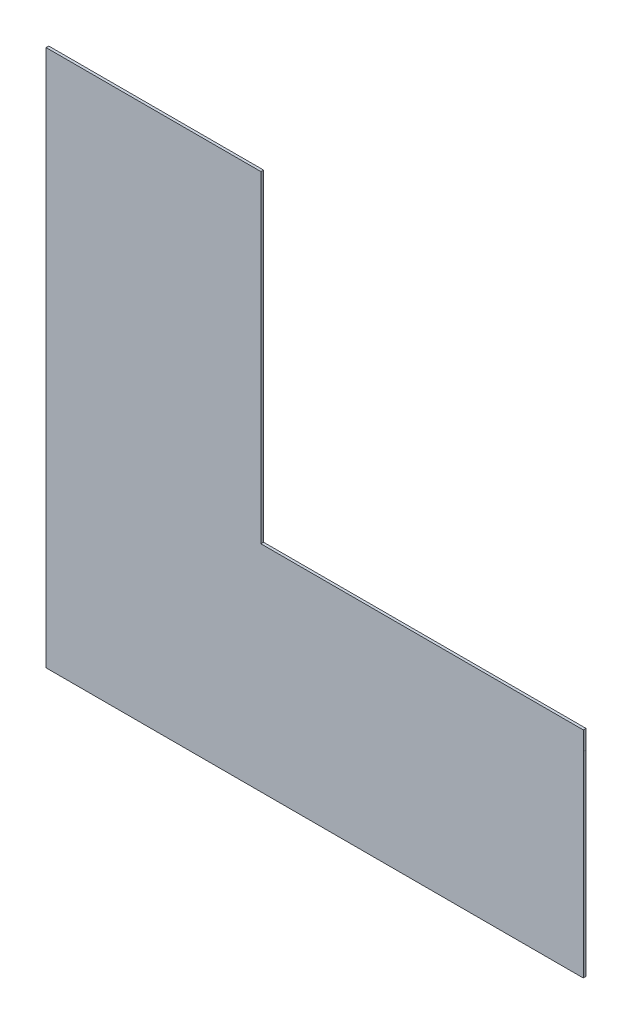
ISO-10303-21;
HEADER;
FILE_DESCRIPTION(('STEP AP214'),'2;1');
FILE_NAME('part.step','',(''),(''),'','','');
FILE_SCHEMA(('AUTOMOTIVE_DESIGN { 1 0 10303 214 1 1 1 1 }'));
ENDSEC;
DATA;
#1=APPLICATION_CONTEXT('core data for automotive mechanical design processes');
#2=APPLICATION_PROTOCOL_DEFINITION('international standard','automotive_design',2000,#1);
#3=PRODUCT_CONTEXT('',#1,'mechanical');
#4=PRODUCT('Part','Part','',(#3));
#5=PRODUCT_RELATED_PRODUCT_CATEGORY('part','',(#4));
#6=PRODUCT_DEFINITION_FORMATION('','',#4);
#7=PRODUCT_DEFINITION_CONTEXT('part definition',#1,'design');
#8=PRODUCT_DEFINITION('design','',#6,#7);
#9=PRODUCT_DEFINITION_SHAPE('','',#8);
#10=(LENGTH_UNIT() NAMED_UNIT(*) SI_UNIT(.MILLI.,.METRE.));
#11=(NAMED_UNIT(*) PLANE_ANGLE_UNIT() SI_UNIT($,.RADIAN.));
#12=(NAMED_UNIT(*) SI_UNIT($,.STERADIAN.) SOLID_ANGLE_UNIT());
#13=UNCERTAINTY_MEASURE_WITH_UNIT(LENGTH_MEASURE(1.E-05),#10,'distance_accuracy_value','');
#14=(GEOMETRIC_REPRESENTATION_CONTEXT(3) GLOBAL_UNCERTAINTY_ASSIGNED_CONTEXT((#13)) GLOBAL_UNIT_ASSIGNED_CONTEXT((#10,
#11,#12)) REPRESENTATION_CONTEXT('',''));
#15=CARTESIAN_POINT('',(0.,0.,0.));
#16=DIRECTION('',(0.,0.,1.));
#17=DIRECTION('',(1.,0.,0.));
#18=AXIS2_PLACEMENT_3D('',#15,#16,#17);
#19=CARTESIAN_POINT('',(200.,0.,1.));
#20=DIRECTION('',(-1.,0.,0.));
#21=DIRECTION('',(0.,0.,1.));
#22=AXIS2_PLACEMENT_3D('',#19,#20,#21);
#23=PLANE('',#22);
#24=DIRECTION('',(0.,0.,-1.));
#25=VECTOR('',#24,1.);
#26=CARTESIAN_POINT('',(200.,73.,1.));
#27=LINE('',#26,#25);
#28=CARTESIAN_POINT('',(200.,73.,1.));
#29=VERTEX_POINT('',#28);
#30=CARTESIAN_POINT('',(200.,73.,0.));
#31=VERTEX_POINT('',#30);
#32=EDGE_CURVE('E11',#29,#31,#27,.T.);
#33=ORIENTED_EDGE('',*,*,#32,.F.);
#34=DIRECTION('',(0.,1.,0.));
#35=VECTOR('',#34,1.);
#36=CARTESIAN_POINT('',(200.,0.,1.));
#37=LINE('',#36,#35);
#38=CARTESIAN_POINT('',(200.,0.,1.));
#39=VERTEX_POINT('',#38);
#40=EDGE_CURVE('E175',#39,#29,#37,.T.);
#41=ORIENTED_EDGE('',*,*,#40,.F.);
#42=DIRECTION('',(0.,0.,-1.));
#43=VECTOR('',#42,1.);
#44=CARTESIAN_POINT('',(200.,0.,1.));
#45=LINE('',#44,#43);
#46=CARTESIAN_POINT('',(200.,0.,0.));
#47=VERTEX_POINT('',#46);
#48=EDGE_CURVE('E112',#39,#47,#45,.T.);
#49=ORIENTED_EDGE('',*,*,#48,.T.);
#50=DIRECTION('',(0.,1.,0.));
#51=VECTOR('',#50,1.);
#52=CARTESIAN_POINT('',(200.,0.,0.));
#53=LINE('',#52,#51);
#54=EDGE_CURVE('E158',#47,#31,#53,.T.);
#55=ORIENTED_EDGE('',*,*,#54,.T.);
#56=EDGE_LOOP('',(#33,#41,#49,#55));
#57=FACE_BOUND('',#56,.T.);
#58=ADVANCED_FACE('F49',(#57),#23,.F.);
#59=CARTESIAN_POINT('',(0.,200.,1.));
#60=DIRECTION('',(1.,0.,0.));
#61=DIRECTION('',(0.,1.,0.));
#62=AXIS2_PLACEMENT_3D('',#59,#60,#61);
#63=PLANE('',#62);
#64=DIRECTION('',(0.,-1.,0.));
#65=VECTOR('',#64,1.);
#66=CARTESIAN_POINT('',(0.,200.,0.));
#67=LINE('',#66,#65);
#68=CARTESIAN_POINT('',(0.,200.,0.));
#69=VERTEX_POINT('',#68);
#70=CARTESIAN_POINT('',(0.,0.,0.));
#71=VERTEX_POINT('',#70);
#72=EDGE_CURVE('E130',#69,#71,#67,.T.);
#73=ORIENTED_EDGE('',*,*,#72,.T.);
#74=DIRECTION('',(0.,0.,-1.));
#75=VECTOR('',#74,1.);
#76=CARTESIAN_POINT('',(0.,0.,1.));
#77=LINE('',#76,#75);
#78=CARTESIAN_POINT('',(0.,0.,1.));
#79=VERTEX_POINT('',#78);
#80=EDGE_CURVE('E58',#79,#71,#77,.T.);
#81=ORIENTED_EDGE('',*,*,#80,.F.);
#82=DIRECTION('',(0.,-1.,0.));
#83=VECTOR('',#82,1.);
#84=CARTESIAN_POINT('',(0.,200.,1.));
#85=LINE('',#84,#83);
#86=CARTESIAN_POINT('',(0.,200.,1.));
#87=VERTEX_POINT('',#86);
#88=EDGE_CURVE('E117',#87,#79,#85,.T.);
#89=ORIENTED_EDGE('',*,*,#88,.F.);
#90=DIRECTION('',(0.,0.,-1.));
#91=VECTOR('',#90,1.);
#92=CARTESIAN_POINT('',(0.,200.,1.));
#93=LINE('',#92,#91);
#94=EDGE_CURVE('E147',#87,#69,#93,.T.);
#95=ORIENTED_EDGE('',*,*,#94,.T.);
#96=EDGE_LOOP('',(#73,#81,#89,#95));
#97=FACE_BOUND('',#96,.T.);
#98=ADVANCED_FACE('F51',(#97),#63,.F.);
#99=CARTESIAN_POINT('',(0.,0.,1.));
#100=DIRECTION('',(0.,1.,0.));
#101=DIRECTION('',(0.,0.,1.));
#102=AXIS2_PLACEMENT_3D('',#99,#100,#101);
#103=PLANE('',#102);
#104=DIRECTION('',(1.,0.,0.));
#105=VECTOR('',#104,1.);
#106=CARTESIAN_POINT('',(0.,0.,0.));
#107=LINE('',#106,#105);
#108=EDGE_CURVE('E162',#71,#47,#107,.T.);
#109=ORIENTED_EDGE('',*,*,#108,.T.);
#110=ORIENTED_EDGE('',*,*,#48,.F.);
#111=DIRECTION('',(1.,0.,0.));
#112=VECTOR('',#111,1.);
#113=CARTESIAN_POINT('',(0.,0.,1.));
#114=LINE('',#113,#112);
#115=EDGE_CURVE('E106',#79,#39,#114,.T.);
#116=ORIENTED_EDGE('',*,*,#115,.F.);
#117=ORIENTED_EDGE('',*,*,#80,.T.);
#118=EDGE_LOOP('',(#109,#110,#116,#117));
#119=FACE_BOUND('',#118,.T.);
#120=ADVANCED_FACE('F108',(#119),#103,.F.);
#121=CARTESIAN_POINT('',(200.,80.,1.));
#122=VERTEX_POINT('',#121);
#123=EDGE_CURVE('E116',#29,#122,#37,.T.);
#124=ORIENTED_EDGE('',*,*,#123,.F.);
#125=ORIENTED_EDGE('',*,*,#32,.T.);
#126=CARTESIAN_POINT('',(200.,80.,0.));
#127=VERTEX_POINT('',#126);
#128=EDGE_CURVE('E161',#31,#127,#53,.T.);
#129=ORIENTED_EDGE('',*,*,#128,.T.);
#130=DIRECTION('',(0.,0.,-1.));
#131=VECTOR('',#130,1.);
#132=CARTESIAN_POINT('',(200.,80.,1.));
#133=LINE('',#132,#131);
#134=EDGE_CURVE('E133',#122,#127,#133,.T.);
#135=ORIENTED_EDGE('',*,*,#134,.F.);
#136=EDGE_LOOP('',(#124,#125,#129,#135));
#137=FACE_BOUND('',#136,.T.);
#138=ADVANCED_FACE('F181',(#137),#23,.F.);
#139=CARTESIAN_POINT('',(200.,80.,1.));
#140=DIRECTION('',(0.,-1.,0.));
#141=DIRECTION('',(0.,0.,-1.));
#142=AXIS2_PLACEMENT_3D('',#139,#140,#141);
#143=PLANE('',#142);
#144=DIRECTION('',(-1.,0.,0.));
#145=VECTOR('',#144,1.);
#146=CARTESIAN_POINT('',(200.,80.,0.));
#147=LINE('',#146,#145);
#148=CARTESIAN_POINT('',(80.,80.,0.));
#149=VERTEX_POINT('',#148);
#150=EDGE_CURVE('E155',#127,#149,#147,.T.);
#151=ORIENTED_EDGE('',*,*,#150,.T.);
#152=DIRECTION('',(0.,0.,-1.));
#153=VECTOR('',#152,1.);
#154=CARTESIAN_POINT('',(80.,80.,1.));
#155=LINE('',#154,#153);
#156=CARTESIAN_POINT('',(80.,80.,1.));
#157=VERTEX_POINT('',#156);
#158=EDGE_CURVE('E139',#157,#149,#155,.T.);
#159=ORIENTED_EDGE('',*,*,#158,.F.);
#160=DIRECTION('',(-1.,0.,0.));
#161=VECTOR('',#160,1.);
#162=CARTESIAN_POINT('',(200.,80.,1.));
#163=LINE('',#162,#161);
#164=EDGE_CURVE('E172',#122,#157,#163,.T.);
#165=ORIENTED_EDGE('',*,*,#164,.F.);
#166=ORIENTED_EDGE('',*,*,#134,.T.);
#167=EDGE_LOOP('',(#151,#159,#165,#166));
#168=FACE_BOUND('',#167,.T.);
#169=ADVANCED_FACE('F184',(#168),#143,.F.);
#170=CARTESIAN_POINT('',(80.,80.,1.));
#171=DIRECTION('',(-1.,0.,0.));
#172=DIRECTION('',(0.,-1.,0.));
#173=AXIS2_PLACEMENT_3D('',#170,#171,#172);
#174=PLANE('',#173);
#175=DIRECTION('',(0.,1.,0.));
#176=VECTOR('',#175,1.);
#177=CARTESIAN_POINT('',(80.,80.,0.));
#178=LINE('',#177,#176);
#179=CARTESIAN_POINT('',(80.0000000000001,200.,0.));
#180=VERTEX_POINT('',#179);
#181=EDGE_CURVE('E152',#149,#180,#178,.T.);
#182=ORIENTED_EDGE('',*,*,#181,.T.);
#183=DIRECTION('',(0.,0.,-1.));
#184=VECTOR('',#183,1.);
#185=CARTESIAN_POINT('',(80.0000000000001,200.,1.));
#186=LINE('',#185,#184);
#187=CARTESIAN_POINT('',(80.0000000000001,200.,1.));
#188=VERTEX_POINT('',#187);
#189=EDGE_CURVE('E143',#188,#180,#186,.T.);
#190=ORIENTED_EDGE('',*,*,#189,.F.);
#191=DIRECTION('',(0.,1.,0.));
#192=VECTOR('',#191,1.);
#193=CARTESIAN_POINT('',(80.,80.,1.));
#194=LINE('',#193,#192);
#195=EDGE_CURVE('E169',#157,#188,#194,.T.);
#196=ORIENTED_EDGE('',*,*,#195,.F.);
#197=ORIENTED_EDGE('',*,*,#158,.T.);
#198=EDGE_LOOP('',(#182,#190,#196,#197));
#199=FACE_BOUND('',#198,.T.);
#200=ADVANCED_FACE('F189',(#199),#174,.F.);
#201=CARTESIAN_POINT('',(80.0000000000001,200.,1.));
#202=DIRECTION('',(0.,-1.,0.));
#203=DIRECTION('',(0.,0.,-1.));
#204=AXIS2_PLACEMENT_3D('',#201,#202,#203);
#205=PLANE('',#204);
#206=DIRECTION('',(-1.,0.,0.));
#207=VECTOR('',#206,1.);
#208=CARTESIAN_POINT('',(80.0000000000001,200.,0.));
#209=LINE('',#208,#207);
#210=EDGE_CURVE('E127',#180,#69,#209,.T.);
#211=ORIENTED_EDGE('',*,*,#210,.T.);
#212=ORIENTED_EDGE('',*,*,#94,.F.);
#213=DIRECTION('',(-1.,0.,0.));
#214=VECTOR('',#213,1.);
#215=CARTESIAN_POINT('',(80.0000000000001,200.,1.));
#216=LINE('',#215,#214);
#217=EDGE_CURVE('E122',#188,#87,#216,.T.);
#218=ORIENTED_EDGE('',*,*,#217,.F.);
#219=ORIENTED_EDGE('',*,*,#189,.T.);
#220=EDGE_LOOP('',(#211,#212,#218,#219));
#221=FACE_BOUND('',#220,.T.);
#222=ADVANCED_FACE('F192',(#221),#205,.F.);
#223=CARTESIAN_POINT('',(0.,0.,1.));
#224=DIRECTION('',(0.,0.,1.));
#225=DIRECTION('',(1.,0.,0.));
#226=AXIS2_PLACEMENT_3D('',#223,#224,#225);
#227=PLANE('',#226);
#228=ORIENTED_EDGE('',*,*,#88,.T.);
#229=ORIENTED_EDGE('',*,*,#115,.T.);
#230=ORIENTED_EDGE('',*,*,#40,.T.);
#231=ORIENTED_EDGE('',*,*,#123,.T.);
#232=ORIENTED_EDGE('',*,*,#164,.T.);
#233=ORIENTED_EDGE('',*,*,#195,.T.);
#234=ORIENTED_EDGE('',*,*,#217,.T.);
#235=EDGE_LOOP('',(#228,#229,#230,#231,#232,#233,#234));
#236=FACE_BOUND('',#235,.T.);
#237=ADVANCED_FACE('F120',(#236),#227,.T.);
#238=CARTESIAN_POINT('',(0.,0.,0.));
#239=DIRECTION('',(0.,0.,1.));
#240=DIRECTION('',(1.,0.,0.));
#241=AXIS2_PLACEMENT_3D('',#238,#239,#240);
#242=PLANE('',#241);
#243=ORIENTED_EDGE('',*,*,#72,.F.);
#244=ORIENTED_EDGE('',*,*,#210,.F.);
#245=ORIENTED_EDGE('',*,*,#181,.F.);
#246=ORIENTED_EDGE('',*,*,#150,.F.);
#247=ORIENTED_EDGE('',*,*,#128,.F.);
#248=ORIENTED_EDGE('',*,*,#54,.F.);
#249=ORIENTED_EDGE('',*,*,#108,.F.);
#250=EDGE_LOOP('',(#243,#244,#245,#246,#247,#248,#249));
#251=FACE_BOUND('',#250,.T.);
#252=ADVANCED_FACE('F194',(#251),#242,.F.);
#253=CLOSED_SHELL('',(#58,#98,#120,#138,#169,#200,#222,#237,#252));
#254=MANIFOLD_SOLID_BREP('B2',#253);
#255=ADVANCED_BREP_SHAPE_REPRESENTATION('',(#18,#254),#14);
#256=SHAPE_DEFINITION_REPRESENTATION(#9,#255);
ENDSEC;
END-ISO-10303-21;
